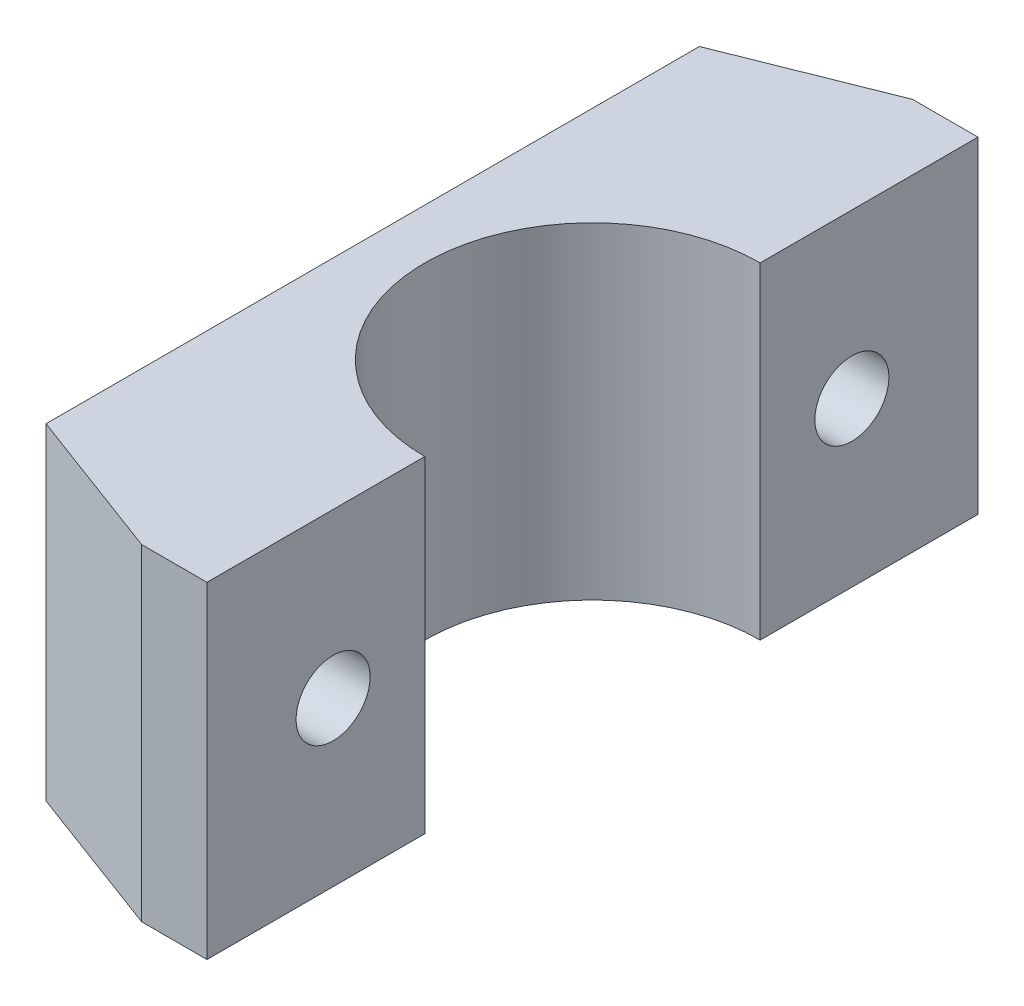
ISO-10303-21;
HEADER;
FILE_DESCRIPTION(('STEP AP214'),'2;1');
FILE_NAME('part.step','',(''),(''),'','','');
FILE_SCHEMA(('AUTOMOTIVE_DESIGN { 1 0 10303 214 1 1 1 1 }'));
ENDSEC;
DATA;
#1=APPLICATION_CONTEXT('core data for automotive mechanical design processes');
#2=APPLICATION_PROTOCOL_DEFINITION('international standard','automotive_design',2000,#1);
#3=PRODUCT_CONTEXT('',#1,'mechanical');
#4=PRODUCT('Part','Part','',(#3));
#5=PRODUCT_RELATED_PRODUCT_CATEGORY('part','',(#4));
#6=PRODUCT_DEFINITION_FORMATION('','',#4);
#7=PRODUCT_DEFINITION_CONTEXT('part definition',#1,'design');
#8=PRODUCT_DEFINITION('design','',#6,#7);
#9=PRODUCT_DEFINITION_SHAPE('','',#8);
#10=(LENGTH_UNIT() NAMED_UNIT(*) SI_UNIT(.MILLI.,.METRE.));
#11=(NAMED_UNIT(*) PLANE_ANGLE_UNIT() SI_UNIT($,.RADIAN.));
#12=(NAMED_UNIT(*) SI_UNIT($,.STERADIAN.) SOLID_ANGLE_UNIT());
#13=UNCERTAINTY_MEASURE_WITH_UNIT(LENGTH_MEASURE(1.E-05),#10,'distance_accuracy_value','');
#14=(GEOMETRIC_REPRESENTATION_CONTEXT(3) GLOBAL_UNCERTAINTY_ASSIGNED_CONTEXT((#13)) GLOBAL_UNIT_ASSIGNED_CONTEXT((#10,
#11,#12)) REPRESENTATION_CONTEXT('',''));
#15=CARTESIAN_POINT('',(0.,0.,0.));
#16=DIRECTION('',(0.,0.,1.));
#17=DIRECTION('',(1.,0.,0.));
#18=AXIS2_PLACEMENT_3D('',#15,#16,#17);
#19=CARTESIAN_POINT('',(0.,15.,0.));
#20=DIRECTION('',(0.,-1.,0.));
#21=DIRECTION('',(0.,0.,-1.));
#22=AXIS2_PLACEMENT_3D('',#19,#20,#21);
#23=CYLINDRICAL_SURFACE('',#22,7.7);
#24=CARTESIAN_POINT('',(0.,0.,0.));
#25=DIRECTION('',(0.,-1.,0.));
#26=DIRECTION('',(0.,0.,1.));
#27=AXIS2_PLACEMENT_3D('',#24,#25,#26);
#28=CIRCLE('',#27,7.7);
#29=CARTESIAN_POINT('',(0.,0.,7.7));
#30=VERTEX_POINT('',#29);
#31=CARTESIAN_POINT('',(0.,0.,-7.7));
#32=VERTEX_POINT('',#31);
#33=EDGE_CURVE('E134',#30,#32,#28,.T.);
#34=ORIENTED_EDGE('',*,*,#33,.T.);
#35=DIRECTION('',(0.,-1.,0.));
#36=VECTOR('',#35,1.);
#37=CARTESIAN_POINT('',(0.,15.,-7.7));
#38=LINE('',#37,#36);
#39=CARTESIAN_POINT('',(0.,15.,-7.7));
#40=VERTEX_POINT('',#39);
#41=EDGE_CURVE('E11',#40,#32,#38,.T.);
#42=ORIENTED_EDGE('',*,*,#41,.F.);
#43=CARTESIAN_POINT('',(0.,15.,0.));
#44=DIRECTION('',(0.,-1.,0.));
#45=DIRECTION('',(0.,0.,1.));
#46=AXIS2_PLACEMENT_3D('',#43,#44,#45);
#47=CIRCLE('',#46,7.7);
#48=CARTESIAN_POINT('',(0.,15.,7.7));
#49=VERTEX_POINT('',#48);
#50=EDGE_CURVE('E149',#49,#40,#47,.T.);
#51=ORIENTED_EDGE('',*,*,#50,.F.);
#52=DIRECTION('',(0.,-1.,0.));
#53=VECTOR('',#52,1.);
#54=CARTESIAN_POINT('',(0.,15.,7.7));
#55=LINE('',#54,#53);
#56=EDGE_CURVE('E130',#49,#30,#55,.T.);
#57=ORIENTED_EDGE('',*,*,#56,.T.);
#58=EDGE_LOOP('',(#34,#42,#51,#57));
#59=FACE_BOUND('',#58,.T.);
#60=ADVANCED_FACE('F37',(#59),#23,.F.);
#61=CARTESIAN_POINT('',(0.,15.,-7.7));
#62=DIRECTION('',(-1.,0.,0.));
#63=DIRECTION('',(0.,0.,1.));
#64=AXIS2_PLACEMENT_3D('',#61,#62,#63);
#65=PLANE('',#64);
#66=CARTESIAN_POINT('',(0.,7.5,-11.9091605645859));
#67=DIRECTION('',(-1.,0.,0.));
#68=DIRECTION('',(0.,0.,1.));
#69=AXIS2_PLACEMENT_3D('',#66,#67,#68);
#70=CIRCLE('',#69,1.7);
#71=CARTESIAN_POINT('',(0.,7.5,-10.2091605645859));
#72=VERTEX_POINT('',#71);
#73=EDGE_CURVE('E138',#72,#72,#70,.T.);
#74=ORIENTED_EDGE('',*,*,#73,.T.);
#75=EDGE_LOOP('',(#74));
#76=FACE_BOUND('',#75,.T.);
#77=DIRECTION('',(0.,0.,-1.));
#78=VECTOR('',#77,1.);
#79=CARTESIAN_POINT('',(0.,0.,-7.7));
#80=LINE('',#79,#78);
#81=CARTESIAN_POINT('',(0.,0.,-17.7));
#82=VERTEX_POINT('',#81);
#83=EDGE_CURVE('E137',#32,#82,#80,.T.);
#84=ORIENTED_EDGE('',*,*,#83,.T.);
#85=DIRECTION('',(0.,-1.,0.));
#86=VECTOR('',#85,1.);
#87=CARTESIAN_POINT('',(0.,15.,-17.7));
#88=LINE('',#87,#86);
#89=CARTESIAN_POINT('',(0.,15.,-17.7));
#90=VERTEX_POINT('',#89);
#91=EDGE_CURVE('E46',#90,#82,#88,.T.);
#92=ORIENTED_EDGE('',*,*,#91,.F.);
#93=DIRECTION('',(0.,0.,-1.));
#94=VECTOR('',#93,1.);
#95=CARTESIAN_POINT('',(0.,15.,-7.7));
#96=LINE('',#95,#94);
#97=EDGE_CURVE('E97',#40,#90,#96,.T.);
#98=ORIENTED_EDGE('',*,*,#97,.F.);
#99=ORIENTED_EDGE('',*,*,#41,.T.);
#100=EDGE_LOOP('',(#84,#92,#98,#99));
#101=FACE_BOUND('',#100,.T.);
#102=ADVANCED_FACE('F210',(#76,#101),#65,.F.);
#103=CARTESIAN_POINT('',(0.,15.,-17.7));
#104=DIRECTION('',(0.,0.,1.));
#105=DIRECTION('',(1.,0.,0.));
#106=AXIS2_PLACEMENT_3D('',#103,#104,#105);
#107=PLANE('',#106);
#108=DIRECTION('',(-1.,0.,0.));
#109=VECTOR('',#108,1.);
#110=CARTESIAN_POINT('',(0.,0.,-17.7));
#111=LINE('',#110,#109);
#112=CARTESIAN_POINT('',(-3.,0.,-17.7));
#113=VERTEX_POINT('',#112);
#114=EDGE_CURVE('E140',#82,#113,#111,.T.);
#115=ORIENTED_EDGE('',*,*,#114,.T.);
#116=DIRECTION('',(0.,-1.,0.));
#117=VECTOR('',#116,1.);
#118=CARTESIAN_POINT('',(-3.,15.,-17.7));
#119=LINE('',#118,#117);
#120=CARTESIAN_POINT('',(-3.,15.,-17.7));
#121=VERTEX_POINT('',#120);
#122=EDGE_CURVE('E156',#121,#113,#119,.T.);
#123=ORIENTED_EDGE('',*,*,#122,.F.);
#124=DIRECTION('',(-1.,0.,0.));
#125=VECTOR('',#124,1.);
#126=CARTESIAN_POINT('',(0.,15.,-17.7));
#127=LINE('',#126,#125);
#128=EDGE_CURVE('E165',#90,#121,#127,.T.);
#129=ORIENTED_EDGE('',*,*,#128,.F.);
#130=ORIENTED_EDGE('',*,*,#91,.T.);
#131=EDGE_LOOP('',(#115,#123,#129,#130));
#132=FACE_BOUND('',#131,.T.);
#133=ADVANCED_FACE('F163',(#132),#107,.F.);
#134=CARTESIAN_POINT('',(-3.,15.,-17.7));
#135=DIRECTION('',(0.370342508136175,0.,0.928895272174106));
#136=DIRECTION('',(0.928895272174106,0.,-0.370342508136175));
#137=AXIS2_PLACEMENT_3D('',#134,#135,#136);
#138=PLANE('',#137);
#139=DIRECTION('',(-0.928895272174106,0.,0.370342508136175));
#140=VECTOR('',#139,1.);
#141=CARTESIAN_POINT('',(-3.,0.,-17.7));
#142=LINE('',#141,#140);
#143=CARTESIAN_POINT('',(-10.,0.,-14.9091605645859));
#144=VERTEX_POINT('',#143);
#145=EDGE_CURVE('E142',#113,#144,#142,.T.);
#146=ORIENTED_EDGE('',*,*,#145,.T.);
#147=DIRECTION('',(0.,-1.,0.));
#148=VECTOR('',#147,1.);
#149=CARTESIAN_POINT('',(-10.,15.,-14.9091605645859));
#150=LINE('',#149,#148);
#151=CARTESIAN_POINT('',(-10.,15.,-14.9091605645859));
#152=VERTEX_POINT('',#151);
#153=EDGE_CURVE('E153',#152,#144,#150,.T.);
#154=ORIENTED_EDGE('',*,*,#153,.F.);
#155=DIRECTION('',(-0.928895272174106,0.,0.370342508136175));
#156=VECTOR('',#155,1.);
#157=CARTESIAN_POINT('',(-3.,15.,-17.7));
#158=LINE('',#157,#156);
#159=EDGE_CURVE('E177',#121,#152,#158,.T.);
#160=ORIENTED_EDGE('',*,*,#159,.F.);
#161=ORIENTED_EDGE('',*,*,#122,.T.);
#162=EDGE_LOOP('',(#146,#154,#160,#161));
#163=FACE_BOUND('',#162,.T.);
#164=ADVANCED_FACE('F173',(#163),#138,.F.);
#165=CARTESIAN_POINT('',(-10.,15.,-14.9091605645859));
#166=DIRECTION('',(1.,0.,0.));
#167=DIRECTION('',(0.,0.,-1.));
#168=AXIS2_PLACEMENT_3D('',#165,#166,#167);
#169=PLANE('',#168);
#170=CARTESIAN_POINT('',(-10.,7.5,-11.9091605645859));
#171=DIRECTION('',(-1.,0.,0.));
#172=DIRECTION('',(0.,0.,1.));
#173=AXIS2_PLACEMENT_3D('',#170,#171,#172);
#174=CIRCLE('',#173,1.7);
#175=CARTESIAN_POINT('',(-10.,7.5,-10.2091605645859));
#176=VERTEX_POINT('',#175);
#177=EDGE_CURVE('E188',#176,#176,#174,.T.);
#178=ORIENTED_EDGE('',*,*,#177,.F.);
#179=EDGE_LOOP('',(#178));
#180=FACE_BOUND('',#179,.T.);
#181=CARTESIAN_POINT('',(-10.,7.5,11.9091605645859));
#182=DIRECTION('',(-1.,0.,0.));
#183=DIRECTION('',(0.,0.,-1.));
#184=AXIS2_PLACEMENT_3D('',#181,#182,#183);
#185=CIRCLE('',#184,1.7);
#186=CARTESIAN_POINT('',(-10.,7.5,10.2091605645859));
#187=VERTEX_POINT('',#186);
#188=EDGE_CURVE('E185',#187,#187,#185,.T.);
#189=ORIENTED_EDGE('',*,*,#188,.F.);
#190=EDGE_LOOP('',(#189));
#191=FACE_BOUND('',#190,.T.);
#192=DIRECTION('',(0.,0.,1.));
#193=VECTOR('',#192,1.);
#194=CARTESIAN_POINT('',(-10.,0.,-14.9091605645859));
#195=LINE('',#194,#193);
#196=CARTESIAN_POINT('',(-10.,0.,15.0908394354141));
#197=VERTEX_POINT('',#196);
#198=EDGE_CURVE('E144',#144,#197,#195,.T.);
#199=ORIENTED_EDGE('',*,*,#198,.T.);
#200=DIRECTION('',(0.,-1.,0.));
#201=VECTOR('',#200,1.);
#202=CARTESIAN_POINT('',(-10.,15.,15.0908394354141));
#203=LINE('',#202,#201);
#204=CARTESIAN_POINT('',(-10.,15.,15.0908394354141));
#205=VERTEX_POINT('',#204);
#206=EDGE_CURVE('E125',#205,#197,#203,.T.);
#207=ORIENTED_EDGE('',*,*,#206,.F.);
#208=DIRECTION('',(0.,0.,1.));
#209=VECTOR('',#208,1.);
#210=CARTESIAN_POINT('',(-10.,15.,-14.9091605645859));
#211=LINE('',#210,#209);
#212=EDGE_CURVE('E116',#152,#205,#211,.T.);
#213=ORIENTED_EDGE('',*,*,#212,.F.);
#214=ORIENTED_EDGE('',*,*,#153,.T.);
#215=EDGE_LOOP('',(#199,#207,#213,#214));
#216=FACE_BOUND('',#215,.T.);
#217=ADVANCED_FACE('F176',(#180,#191,#216),#169,.F.);
#218=CARTESIAN_POINT('',(-10.,15.,15.0908394354141));
#219=DIRECTION('',(0.349263876828636,0.,-0.937024409683457));
#220=DIRECTION('',(-0.937024409683457,0.,-0.349263876828636));
#221=AXIS2_PLACEMENT_3D('',#218,#219,#220);
#222=PLANE('',#221);
#223=DIRECTION('',(0.937024409683457,0.,0.349263876828636));
#224=VECTOR('',#223,1.);
#225=CARTESIAN_POINT('',(-10.,0.,15.0908394354141));
#226=LINE('',#225,#224);
#227=CARTESIAN_POINT('',(-3.,0.,17.7));
#228=VERTEX_POINT('',#227);
#229=EDGE_CURVE('E124',#197,#228,#226,.T.);
#230=ORIENTED_EDGE('',*,*,#229,.T.);
#231=DIRECTION('',(0.,-1.,0.));
#232=VECTOR('',#231,1.);
#233=CARTESIAN_POINT('',(-3.,15.,17.7));
#234=LINE('',#233,#232);
#235=CARTESIAN_POINT('',(-3.,15.,17.7));
#236=VERTEX_POINT('',#235);
#237=EDGE_CURVE('E121',#236,#228,#234,.T.);
#238=ORIENTED_EDGE('',*,*,#237,.F.);
#239=DIRECTION('',(0.937024409683457,0.,0.349263876828636));
#240=VECTOR('',#239,1.);
#241=CARTESIAN_POINT('',(-10.,15.,15.0908394354141));
#242=LINE('',#241,#240);
#243=EDGE_CURVE('E110',#205,#236,#242,.T.);
#244=ORIENTED_EDGE('',*,*,#243,.F.);
#245=ORIENTED_EDGE('',*,*,#206,.T.);
#246=EDGE_LOOP('',(#230,#238,#244,#245));
#247=FACE_BOUND('',#246,.T.);
#248=ADVANCED_FACE('F122',(#247),#222,.F.);
#249=CARTESIAN_POINT('',(-3.,15.,17.7));
#250=DIRECTION('',(0.,0.,-1.));
#251=DIRECTION('',(-1.,0.,0.));
#252=AXIS2_PLACEMENT_3D('',#249,#250,#251);
#253=PLANE('',#252);
#254=DIRECTION('',(1.,0.,0.));
#255=VECTOR('',#254,1.);
#256=CARTESIAN_POINT('',(-3.,0.,17.7));
#257=LINE('',#256,#255);
#258=CARTESIAN_POINT('',(0.,0.,17.7));
#259=VERTEX_POINT('',#258);
#260=EDGE_CURVE('E83',#228,#259,#257,.T.);
#261=ORIENTED_EDGE('',*,*,#260,.T.);
#262=DIRECTION('',(0.,-1.,0.));
#263=VECTOR('',#262,1.);
#264=CARTESIAN_POINT('',(0.,15.,17.7));
#265=LINE('',#264,#263);
#266=CARTESIAN_POINT('',(0.,15.,17.7));
#267=VERTEX_POINT('',#266);
#268=EDGE_CURVE('E126',#267,#259,#265,.T.);
#269=ORIENTED_EDGE('',*,*,#268,.F.);
#270=DIRECTION('',(1.,0.,0.));
#271=VECTOR('',#270,1.);
#272=CARTESIAN_POINT('',(-3.,15.,17.7));
#273=LINE('',#272,#271);
#274=EDGE_CURVE('E114',#236,#267,#273,.T.);
#275=ORIENTED_EDGE('',*,*,#274,.F.);
#276=ORIENTED_EDGE('',*,*,#237,.T.);
#277=EDGE_LOOP('',(#261,#269,#275,#276));
#278=FACE_BOUND('',#277,.T.);
#279=ADVANCED_FACE('F128',(#278),#253,.F.);
#280=CARTESIAN_POINT('',(0.,15.,17.7));
#281=DIRECTION('',(-1.,0.,0.));
#282=DIRECTION('',(0.,0.,1.));
#283=AXIS2_PLACEMENT_3D('',#280,#281,#282);
#284=PLANE('',#283);
#285=CARTESIAN_POINT('',(0.,7.5,11.9091605645859));
#286=DIRECTION('',(-1.,0.,0.));
#287=DIRECTION('',(0.,0.,1.));
#288=AXIS2_PLACEMENT_3D('',#285,#286,#287);
#289=CIRCLE('',#288,1.7);
#290=CARTESIAN_POINT('',(0.,7.5,13.6091605645859));
#291=VERTEX_POINT('',#290);
#292=EDGE_CURVE('E40',#291,#291,#289,.T.);
#293=ORIENTED_EDGE('',*,*,#292,.T.);
#294=EDGE_LOOP('',(#293));
#295=FACE_BOUND('',#294,.T.);
#296=DIRECTION('',(0.,0.,-1.));
#297=VECTOR('',#296,1.);
#298=CARTESIAN_POINT('',(0.,0.,17.7));
#299=LINE('',#298,#297);
#300=EDGE_CURVE('E89',#259,#30,#299,.T.);
#301=ORIENTED_EDGE('',*,*,#300,.T.);
#302=ORIENTED_EDGE('',*,*,#56,.F.);
#303=DIRECTION('',(0.,0.,-1.));
#304=VECTOR('',#303,1.);
#305=CARTESIAN_POINT('',(0.,15.,17.7));
#306=LINE('',#305,#304);
#307=EDGE_CURVE('E54',#267,#49,#306,.T.);
#308=ORIENTED_EDGE('',*,*,#307,.F.);
#309=ORIENTED_EDGE('',*,*,#268,.T.);
#310=EDGE_LOOP('',(#301,#302,#308,#309));
#311=FACE_BOUND('',#310,.T.);
#312=ADVANCED_FACE('F195',(#295,#311),#284,.F.);
#313=CARTESIAN_POINT('',(0.,15.,0.));
#314=DIRECTION('',(0.,1.,0.));
#315=DIRECTION('',(0.,0.,1.));
#316=AXIS2_PLACEMENT_3D('',#313,#314,#315);
#317=PLANE('',#316);
#318=ORIENTED_EDGE('',*,*,#50,.T.);
#319=ORIENTED_EDGE('',*,*,#97,.T.);
#320=ORIENTED_EDGE('',*,*,#128,.T.);
#321=ORIENTED_EDGE('',*,*,#159,.T.);
#322=ORIENTED_EDGE('',*,*,#212,.T.);
#323=ORIENTED_EDGE('',*,*,#243,.T.);
#324=ORIENTED_EDGE('',*,*,#274,.T.);
#325=ORIENTED_EDGE('',*,*,#307,.T.);
#326=EDGE_LOOP('',(#318,#319,#320,#321,#322,#323,#324,#325));
#327=FACE_BOUND('',#326,.T.);
#328=ADVANCED_FACE('F112',(#327),#317,.T.);
#329=CARTESIAN_POINT('',(0.,0.,0.));
#330=DIRECTION('',(0.,1.,0.));
#331=DIRECTION('',(0.,0.,1.));
#332=AXIS2_PLACEMENT_3D('',#329,#330,#331);
#333=PLANE('',#332);
#334=ORIENTED_EDGE('',*,*,#33,.F.);
#335=ORIENTED_EDGE('',*,*,#300,.F.);
#336=ORIENTED_EDGE('',*,*,#260,.F.);
#337=ORIENTED_EDGE('',*,*,#229,.F.);
#338=ORIENTED_EDGE('',*,*,#198,.F.);
#339=ORIENTED_EDGE('',*,*,#145,.F.);
#340=ORIENTED_EDGE('',*,*,#114,.F.);
#341=ORIENTED_EDGE('',*,*,#83,.F.);
#342=EDGE_LOOP('',(#334,#335,#336,#337,#338,#339,#340,#341));
#343=FACE_BOUND('',#342,.T.);
#344=ADVANCED_FACE('F169',(#343),#333,.F.);
#345=CARTESIAN_POINT('',(5.,7.5,11.9091605645859));
#346=DIRECTION('',(-1.,0.,0.));
#347=DIRECTION('',(0.,0.,1.));
#348=AXIS2_PLACEMENT_3D('',#345,#346,#347);
#349=CYLINDRICAL_SURFACE('',#348,1.7);
#350=ORIENTED_EDGE('',*,*,#188,.T.);
#351=EDGE_LOOP('',(#350));
#352=FACE_BOUND('',#351,.T.);
#353=ORIENTED_EDGE('',*,*,#292,.F.);
#354=EDGE_LOOP('',(#353));
#355=FACE_BOUND('',#354,.T.);
#356=ADVANCED_FACE('F197',(#352,#355),#349,.F.);
#357=CARTESIAN_POINT('',(5.,7.5,-11.9091605645859));
#358=DIRECTION('',(-1.,0.,0.));
#359=DIRECTION('',(0.,0.,1.));
#360=AXIS2_PLACEMENT_3D('',#357,#358,#359);
#361=CYLINDRICAL_SURFACE('',#360,1.7);
#362=ORIENTED_EDGE('',*,*,#177,.T.);
#363=EDGE_LOOP('',(#362));
#364=FACE_BOUND('',#363,.T.);
#365=ORIENTED_EDGE('',*,*,#73,.F.);
#366=EDGE_LOOP('',(#365));
#367=FACE_BOUND('',#366,.T.);
#368=ADVANCED_FACE('F199',(#364,#367),#361,.F.);
#369=CLOSED_SHELL('',(#60,#102,#133,#164,#217,#248,#279,#312,#328,#344,#356,#368));
#370=MANIFOLD_SOLID_BREP('B2',#369);
#371=ADVANCED_BREP_SHAPE_REPRESENTATION('',(#18,#370),#14);
#372=SHAPE_DEFINITION_REPRESENTATION(#9,#371);
ENDSEC;
END-ISO-10303-21;
